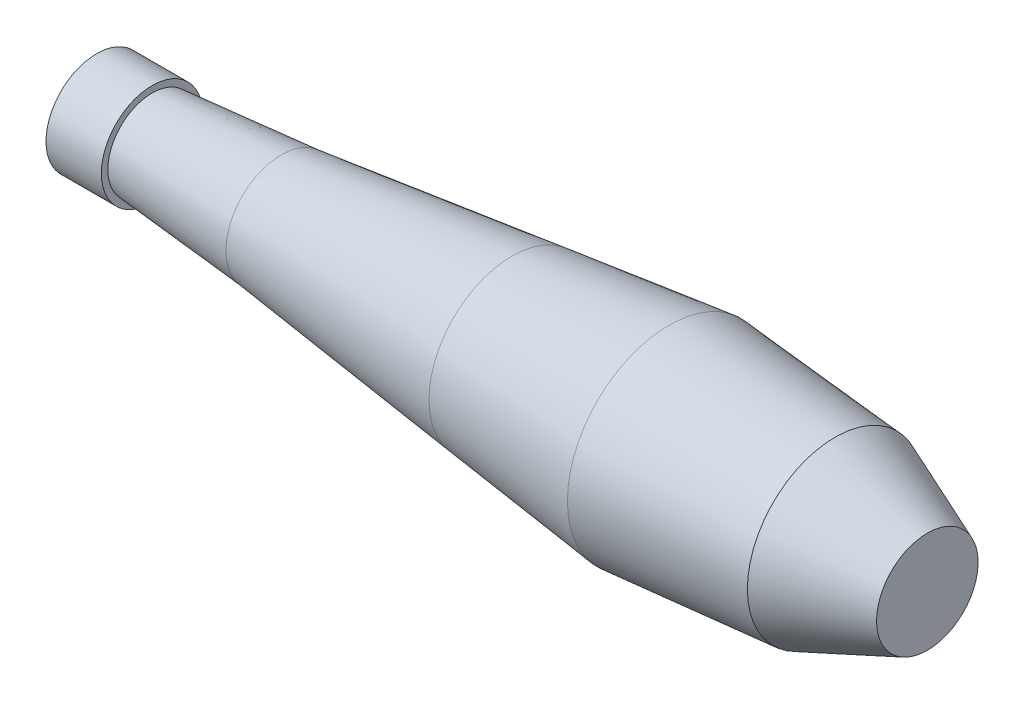
ISO-10303-21;
HEADER;
FILE_DESCRIPTION(('STEP AP214'),'2;1');
FILE_NAME('part.step','',(''),(''),'','','');
FILE_SCHEMA(('AUTOMOTIVE_DESIGN { 1 0 10303 214 1 1 1 1 }'));
ENDSEC;
DATA;
#1=APPLICATION_CONTEXT('core data for automotive mechanical design processes');
#2=APPLICATION_PROTOCOL_DEFINITION('international standard','automotive_design',2000,#1);
#3=PRODUCT_CONTEXT('',#1,'mechanical');
#4=PRODUCT('Part','Part','',(#3));
#5=PRODUCT_RELATED_PRODUCT_CATEGORY('part','',(#4));
#6=PRODUCT_DEFINITION_FORMATION('','',#4);
#7=PRODUCT_DEFINITION_CONTEXT('part definition',#1,'design');
#8=PRODUCT_DEFINITION('design','',#6,#7);
#9=PRODUCT_DEFINITION_SHAPE('','',#8);
#10=(LENGTH_UNIT() NAMED_UNIT(*) SI_UNIT(.MILLI.,.METRE.));
#11=(NAMED_UNIT(*) PLANE_ANGLE_UNIT() SI_UNIT($,.RADIAN.));
#12=(NAMED_UNIT(*) SI_UNIT($,.STERADIAN.) SOLID_ANGLE_UNIT());
#13=UNCERTAINTY_MEASURE_WITH_UNIT(LENGTH_MEASURE(1.E-05),#10,'distance_accuracy_value','');
#14=(GEOMETRIC_REPRESENTATION_CONTEXT(3) GLOBAL_UNCERTAINTY_ASSIGNED_CONTEXT((#13)) GLOBAL_UNIT_ASSIGNED_CONTEXT((#10,
#11,#12)) REPRESENTATION_CONTEXT('',''));
#15=CARTESIAN_POINT('',(0.,0.,0.));
#16=DIRECTION('',(0.,0.,1.));
#17=DIRECTION('',(1.,0.,0.));
#18=AXIS2_PLACEMENT_3D('',#15,#16,#17);
#19=CARTESIAN_POINT('',(0.,0.,0.));
#20=DIRECTION('',(1.,0.,0.));
#21=DIRECTION('',(0.,0.,-1.));
#22=AXIS2_PLACEMENT_3D('',#19,#20,#21);
#23=PLANE('',#22);
#24=CARTESIAN_POINT('',(0.,0.,0.));
#25=DIRECTION('',(-1.,0.,0.));
#26=DIRECTION('',(0.,0.,1.));
#27=AXIS2_PLACEMENT_3D('',#24,#25,#26);
#28=CIRCLE('',#27,5.5);
#29=CARTESIAN_POINT('',(0.,0.,5.5));
#30=VERTEX_POINT('',#29);
#31=EDGE_CURVE('E10',#30,#30,#28,.T.);
#32=ORIENTED_EDGE('',*,*,#31,.T.);
#33=EDGE_LOOP('',(#32));
#34=FACE_BOUND('',#33,.T.);
#35=ADVANCED_FACE('F39',(#34),#23,.F.);
#36=CARTESIAN_POINT('',(0.,0.,0.));
#37=DIRECTION('',(-1.,0.,0.));
#38=DIRECTION('',(0.,0.,1.));
#39=AXIS2_PLACEMENT_3D('',#36,#37,#38);
#40=CYLINDRICAL_SURFACE('',#39,5.5);
#41=ORIENTED_EDGE('',*,*,#31,.F.);
#42=EDGE_LOOP('',(#41));
#43=FACE_BOUND('',#42,.T.);
#44=CARTESIAN_POINT('',(6.,0.,0.));
#45=DIRECTION('',(-1.,0.,0.));
#46=DIRECTION('',(0.,0.,1.));
#47=AXIS2_PLACEMENT_3D('',#44,#45,#46);
#48=CIRCLE('',#47,5.5);
#49=CARTESIAN_POINT('',(6.,0.,5.5));
#50=VERTEX_POINT('',#49);
#51=EDGE_CURVE('E44',#50,#50,#48,.T.);
#52=ORIENTED_EDGE('',*,*,#51,.T.);
#53=EDGE_LOOP('',(#52));
#54=FACE_BOUND('',#53,.T.);
#55=ADVANCED_FACE('F81',(#43,#54),#40,.T.);
#56=CARTESIAN_POINT('',(6.,5.5,0.));
#57=DIRECTION('',(-1.,0.,0.));
#58=DIRECTION('',(0.,0.,1.));
#59=AXIS2_PLACEMENT_3D('',#56,#57,#58);
#60=PLANE('',#59);
#61=ORIENTED_EDGE('',*,*,#51,.F.);
#62=EDGE_LOOP('',(#61));
#63=FACE_BOUND('',#62,.T.);
#64=CARTESIAN_POINT('',(6.,0.,0.));
#65=DIRECTION('',(-1.,0.,0.));
#66=DIRECTION('',(0.,0.,1.));
#67=AXIS2_PLACEMENT_3D('',#64,#65,#66);
#68=CIRCLE('',#67,4.8);
#69=CARTESIAN_POINT('',(6.,0.,4.8));
#70=VERTEX_POINT('',#69);
#71=EDGE_CURVE('E47',#70,#70,#68,.T.);
#72=ORIENTED_EDGE('',*,*,#71,.T.);
#73=EDGE_LOOP('',(#72));
#74=FACE_BOUND('',#73,.T.);
#75=ADVANCED_FACE('F90',(#63,#74),#60,.F.);
#76=CARTESIAN_POINT('',(20.,0.,0.));
#77=DIRECTION('',(1.,0.,0.));
#78=DIRECTION('',(0.,0.,-1.));
#79=AXIS2_PLACEMENT_3D('',#76,#77,#78);
#80=CONICAL_SURFACE('',#79,6.,0.0855052936782047);
#81=ORIENTED_EDGE('',*,*,#71,.F.);
#82=EDGE_LOOP('',(#81));
#83=FACE_BOUND('',#82,.T.);
#84=CARTESIAN_POINT('',(20.,0.,0.));
#85=DIRECTION('',(-1.,0.,0.));
#86=DIRECTION('',(0.,0.,1.));
#87=AXIS2_PLACEMENT_3D('',#84,#85,#86);
#88=CIRCLE('',#87,6.);
#89=CARTESIAN_POINT('',(20.,0.,6.));
#90=VERTEX_POINT('',#89);
#91=EDGE_CURVE('E52',#90,#90,#88,.T.);
#92=ORIENTED_EDGE('',*,*,#91,.T.);
#93=EDGE_LOOP('',(#92));
#94=FACE_BOUND('',#93,.T.);
#95=ADVANCED_FACE('F95',(#83,#94),#80,.T.);
#96=CARTESIAN_POINT('',(45.,0.,0.));
#97=DIRECTION('',(1.,0.,0.));
#98=DIRECTION('',(0.,0.,-1.));
#99=AXIS2_PLACEMENT_3D('',#96,#97,#98);
#100=CONICAL_SURFACE('',#99,9.,0.119428926018338);
#101=ORIENTED_EDGE('',*,*,#91,.F.);
#102=EDGE_LOOP('',(#101));
#103=FACE_BOUND('',#102,.T.);
#104=CARTESIAN_POINT('',(45.,0.,0.));
#105=DIRECTION('',(-1.,0.,0.));
#106=DIRECTION('',(0.,0.,1.));
#107=AXIS2_PLACEMENT_3D('',#104,#105,#106);
#108=CIRCLE('',#107,9.);
#109=CARTESIAN_POINT('',(45.,0.,9.));
#110=VERTEX_POINT('',#109);
#111=EDGE_CURVE('E59',#110,#110,#108,.T.);
#112=ORIENTED_EDGE('',*,*,#111,.T.);
#113=EDGE_LOOP('',(#112));
#114=FACE_BOUND('',#113,.T.);
#115=ADVANCED_FACE('F97',(#103,#114),#100,.T.);
#116=CARTESIAN_POINT('',(62.,0.,0.));
#117=DIRECTION('',(1.,0.,0.));
#118=DIRECTION('',(0.,0.,-1.));
#119=AXIS2_PLACEMENT_3D('',#116,#117,#118);
#120=CONICAL_SURFACE('',#119,11.,0.117108744566864);
#121=ORIENTED_EDGE('',*,*,#111,.F.);
#122=EDGE_LOOP('',(#121));
#123=FACE_BOUND('',#122,.T.);
#124=CARTESIAN_POINT('',(62.,0.,0.));
#125=DIRECTION('',(-1.,0.,0.));
#126=DIRECTION('',(0.,0.,1.));
#127=AXIS2_PLACEMENT_3D('',#124,#125,#126);
#128=CIRCLE('',#127,11.);
#129=CARTESIAN_POINT('',(62.,0.,11.));
#130=VERTEX_POINT('',#129);
#131=EDGE_CURVE('E62',#130,#130,#128,.T.);
#132=ORIENTED_EDGE('',*,*,#131,.T.);
#133=EDGE_LOOP('',(#132));
#134=FACE_BOUND('',#133,.T.);
#135=ADVANCED_FACE('F105',(#123,#134),#120,.T.);
#136=CARTESIAN_POINT('',(80.,0.,0.));
#137=DIRECTION('',(-1.,0.,0.));
#138=DIRECTION('',(0.,0.,1.));
#139=AXIS2_PLACEMENT_3D('',#136,#137,#138);
#140=CONICAL_SURFACE('',#139,9.5,0.0831412318884412);
#141=ORIENTED_EDGE('',*,*,#131,.F.);
#142=EDGE_LOOP('',(#141));
#143=FACE_BOUND('',#142,.T.);
#144=CARTESIAN_POINT('',(80.,0.,0.));
#145=DIRECTION('',(-1.,0.,0.));
#146=DIRECTION('',(0.,0.,1.));
#147=AXIS2_PLACEMENT_3D('',#144,#145,#146);
#148=CIRCLE('',#147,9.5);
#149=CARTESIAN_POINT('',(80.,0.,9.5));
#150=VERTEX_POINT('',#149);
#151=EDGE_CURVE('E64',#150,#150,#148,.T.);
#152=ORIENTED_EDGE('',*,*,#151,.T.);
#153=EDGE_LOOP('',(#152));
#154=FACE_BOUND('',#153,.T.);
#155=ADVANCED_FACE('F80',(#143,#154),#140,.T.);
#156=CARTESIAN_POINT('',(90.,0.,0.));
#157=DIRECTION('',(-1.,0.,0.));
#158=DIRECTION('',(0.,0.,1.));
#159=AXIS2_PLACEMENT_3D('',#156,#157,#158);
#160=CONICAL_SURFACE('',#159,5.5,0.380506377112365);
#161=ORIENTED_EDGE('',*,*,#151,.F.);
#162=EDGE_LOOP('',(#161));
#163=FACE_BOUND('',#162,.T.);
#164=CARTESIAN_POINT('',(90.,0.,0.));
#165=DIRECTION('',(-1.,0.,0.));
#166=DIRECTION('',(0.,0.,1.));
#167=AXIS2_PLACEMENT_3D('',#164,#165,#166);
#168=CIRCLE('',#167,5.5);
#169=CARTESIAN_POINT('',(90.,0.,5.5));
#170=VERTEX_POINT('',#169);
#171=EDGE_CURVE('E70',#170,#170,#168,.T.);
#172=ORIENTED_EDGE('',*,*,#171,.T.);
#173=EDGE_LOOP('',(#172));
#174=FACE_BOUND('',#173,.T.);
#175=ADVANCED_FACE('F72',(#163,#174),#160,.T.);
#176=CARTESIAN_POINT('',(90.,5.5,0.));
#177=DIRECTION('',(-1.,0.,0.));
#178=DIRECTION('',(0.,0.,1.));
#179=AXIS2_PLACEMENT_3D('',#176,#177,#178);
#180=PLANE('',#179);
#181=ORIENTED_EDGE('',*,*,#171,.F.);
#182=EDGE_LOOP('',(#181));
#183=FACE_BOUND('',#182,.T.);
#184=ADVANCED_FACE('F73',(#183),#180,.F.);
#185=CLOSED_SHELL('',(#35,#55,#75,#95,#115,#135,#155,#175,#184));
#186=MANIFOLD_SOLID_BREP('B2',#185);
#187=ADVANCED_BREP_SHAPE_REPRESENTATION('',(#18,#186),#14);
#188=SHAPE_DEFINITION_REPRESENTATION(#9,#187);
ENDSEC;
END-ISO-10303-21;
